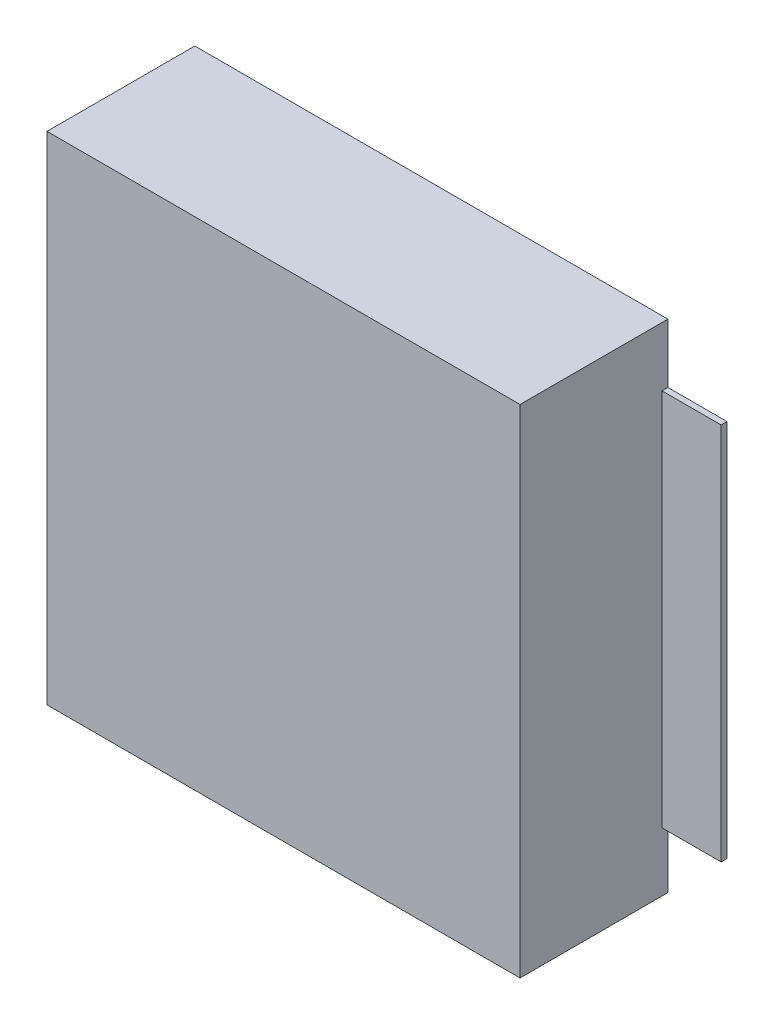
ISO-10303-21;
HEADER;
FILE_DESCRIPTION(('STEP AP214'),'2;1');
FILE_NAME('part.step','',(''),(''),'','','');
FILE_SCHEMA(('AUTOMOTIVE_DESIGN { 1 0 10303 214 1 1 1 1 }'));
ENDSEC;
DATA;
#1=APPLICATION_CONTEXT('core data for automotive mechanical design processes');
#2=APPLICATION_PROTOCOL_DEFINITION('international standard','automotive_design',2000,#1);
#3=PRODUCT_CONTEXT('',#1,'mechanical');
#4=PRODUCT('Part','Part','',(#3));
#5=PRODUCT_RELATED_PRODUCT_CATEGORY('part','',(#4));
#6=PRODUCT_DEFINITION_FORMATION('','',#4);
#7=PRODUCT_DEFINITION_CONTEXT('part definition',#1,'design');
#8=PRODUCT_DEFINITION('design','',#6,#7);
#9=PRODUCT_DEFINITION_SHAPE('','',#8);
#10=(LENGTH_UNIT() NAMED_UNIT(*) SI_UNIT(.MILLI.,.METRE.));
#11=(NAMED_UNIT(*) PLANE_ANGLE_UNIT() SI_UNIT($,.RADIAN.));
#12=(NAMED_UNIT(*) SI_UNIT($,.STERADIAN.) SOLID_ANGLE_UNIT());
#13=UNCERTAINTY_MEASURE_WITH_UNIT(LENGTH_MEASURE(1.E-05),#10,'distance_accuracy_value','');
#14=(GEOMETRIC_REPRESENTATION_CONTEXT(3) GLOBAL_UNCERTAINTY_ASSIGNED_CONTEXT((#13)) GLOBAL_UNIT_ASSIGNED_CONTEXT((#10,
#11,#12)) REPRESENTATION_CONTEXT('',''));
#15=CARTESIAN_POINT('',(0.,0.,0.));
#16=DIRECTION('',(0.,0.,1.));
#17=DIRECTION('',(1.,0.,0.));
#18=AXIS2_PLACEMENT_3D('',#15,#16,#17);
#19=CARTESIAN_POINT('',(-40.,-42.,25.));
#20=DIRECTION('',(1.,0.,0.));
#21=DIRECTION('',(0.,0.,-1.));
#22=AXIS2_PLACEMENT_3D('',#19,#20,#21);
#23=PLANE('',#22);
#24=DIRECTION('',(0.,0.,-1.));
#25=VECTOR('',#24,1.);
#26=CARTESIAN_POINT('',(-40.,42.,25.));
#27=LINE('',#26,#25);
#28=CARTESIAN_POINT('',(-40.,42.,25.));
#29=VERTEX_POINT('',#28);
#30=CARTESIAN_POINT('',(-40.,42.,0.));
#31=VERTEX_POINT('',#30);
#32=EDGE_CURVE('E144',#29,#31,#27,.T.);
#33=ORIENTED_EDGE('',*,*,#32,.T.);
#34=DIRECTION('',(0.,1.,0.));
#35=VECTOR('',#34,1.);
#36=CARTESIAN_POINT('',(-40.,42.,0.));
#37=LINE('',#36,#35);
#38=CARTESIAN_POINT('',(-40.,32.,0.));
#39=VERTEX_POINT('',#38);
#40=EDGE_CURVE('E161',#39,#31,#37,.T.);
#41=ORIENTED_EDGE('',*,*,#40,.F.);
#42=DIRECTION('',(0.,0.,1.));
#43=VECTOR('',#42,1.);
#44=CARTESIAN_POINT('',(-40.,32.,0.));
#45=LINE('',#44,#43);
#46=CARTESIAN_POINT('',(-40.,32.,1.));
#47=VERTEX_POINT('',#46);
#48=EDGE_CURVE('E215',#39,#47,#45,.T.);
#49=ORIENTED_EDGE('',*,*,#48,.T.);
#50=DIRECTION('',(0.,-1.,0.));
#51=VECTOR('',#50,1.);
#52=CARTESIAN_POINT('',(-40.,-42.,1.));
#53=LINE('',#52,#51);
#54=CARTESIAN_POINT('',(-40.,-32.,1.));
#55=VERTEX_POINT('',#54);
#56=EDGE_CURVE('E211',#47,#55,#53,.T.);
#57=ORIENTED_EDGE('',*,*,#56,.T.);
#58=DIRECTION('',(0.,0.,1.));
#59=VECTOR('',#58,1.);
#60=CARTESIAN_POINT('',(-40.,-32.,0.));
#61=LINE('',#60,#59);
#62=CARTESIAN_POINT('',(-40.,-32.,0.));
#63=VERTEX_POINT('',#62);
#64=EDGE_CURVE('E192',#63,#55,#61,.T.);
#65=ORIENTED_EDGE('',*,*,#64,.F.);
#66=DIRECTION('',(0.,1.,0.));
#67=VECTOR('',#66,1.);
#68=CARTESIAN_POINT('',(-40.,-42.,0.));
#69=LINE('',#68,#67);
#70=CARTESIAN_POINT('',(-40.,-42.,0.));
#71=VERTEX_POINT('',#70);
#72=EDGE_CURVE('E190',#71,#63,#69,.T.);
#73=ORIENTED_EDGE('',*,*,#72,.F.);
#74=DIRECTION('',(0.,0.,-1.));
#75=VECTOR('',#74,1.);
#76=CARTESIAN_POINT('',(-40.,-42.,25.));
#77=LINE('',#76,#75);
#78=CARTESIAN_POINT('',(-40.,-42.,25.));
#79=VERTEX_POINT('',#78);
#80=EDGE_CURVE('E11',#79,#71,#77,.T.);
#81=ORIENTED_EDGE('',*,*,#80,.F.);
#82=DIRECTION('',(0.,-1.,0.));
#83=VECTOR('',#82,1.);
#84=CARTESIAN_POINT('',(-40.,-42.,25.));
#85=LINE('',#84,#83);
#86=EDGE_CURVE('E162',#29,#79,#85,.T.);
#87=ORIENTED_EDGE('',*,*,#86,.F.);
#88=EDGE_LOOP('',(#33,#41,#49,#57,#65,#73,#81,#87));
#89=FACE_BOUND('',#88,.T.);
#90=ADVANCED_FACE('F45',(#89),#23,.F.);
#91=CARTESIAN_POINT('',(40.,-42.,25.));
#92=DIRECTION('',(0.,1.,0.));
#93=DIRECTION('',(-1.,0.,0.));
#94=AXIS2_PLACEMENT_3D('',#91,#92,#93);
#95=PLANE('',#94);
#96=DIRECTION('',(1.,0.,0.));
#97=VECTOR('',#96,1.);
#98=CARTESIAN_POINT('',(40.,-42.,0.));
#99=LINE('',#98,#97);
#100=CARTESIAN_POINT('',(40.,-42.,0.));
#101=VERTEX_POINT('',#100);
#102=EDGE_CURVE('E163',#71,#101,#99,.T.);
#103=ORIENTED_EDGE('',*,*,#102,.T.);
#104=DIRECTION('',(0.,0.,-1.));
#105=VECTOR('',#104,1.);
#106=CARTESIAN_POINT('',(40.,-42.,25.));
#107=LINE('',#106,#105);
#108=CARTESIAN_POINT('',(40.,-42.,25.));
#109=VERTEX_POINT('',#108);
#110=EDGE_CURVE('E52',#109,#101,#107,.T.);
#111=ORIENTED_EDGE('',*,*,#110,.F.);
#112=DIRECTION('',(1.,0.,0.));
#113=VECTOR('',#112,1.);
#114=CARTESIAN_POINT('',(40.,-42.,25.));
#115=LINE('',#114,#113);
#116=EDGE_CURVE('E166',#79,#109,#115,.T.);
#117=ORIENTED_EDGE('',*,*,#116,.F.);
#118=ORIENTED_EDGE('',*,*,#80,.T.);
#119=EDGE_LOOP('',(#103,#111,#117,#118));
#120=FACE_BOUND('',#119,.T.);
#121=ADVANCED_FACE('F185',(#120),#95,.F.);
#122=CARTESIAN_POINT('',(40.,-42.,25.));
#123=DIRECTION('',(-1.,0.,0.));
#124=DIRECTION('',(0.,0.,1.));
#125=AXIS2_PLACEMENT_3D('',#122,#123,#124);
#126=PLANE('',#125);
#127=ORIENTED_EDGE('',*,*,#110,.T.);
#128=DIRECTION('',(0.,-1.,0.));
#129=VECTOR('',#128,1.);
#130=CARTESIAN_POINT('',(40.,-42.,0.));
#131=LINE('',#130,#129);
#132=CARTESIAN_POINT('',(40.,-32.,0.));
#133=VERTEX_POINT('',#132);
#134=EDGE_CURVE('E176',#133,#101,#131,.T.);
#135=ORIENTED_EDGE('',*,*,#134,.F.);
#136=DIRECTION('',(0.,0.,1.));
#137=VECTOR('',#136,1.);
#138=CARTESIAN_POINT('',(40.,-32.,0.));
#139=LINE('',#138,#137);
#140=CARTESIAN_POINT('',(40.,-32.,1.));
#141=VERTEX_POINT('',#140);
#142=EDGE_CURVE('E245',#133,#141,#139,.T.);
#143=ORIENTED_EDGE('',*,*,#142,.T.);
#144=DIRECTION('',(0.,1.,0.));
#145=VECTOR('',#144,1.);
#146=CARTESIAN_POINT('',(40.,-42.,1.));
#147=LINE('',#146,#145);
#148=CARTESIAN_POINT('',(40.,32.,1.));
#149=VERTEX_POINT('',#148);
#150=EDGE_CURVE('E202',#141,#149,#147,.T.);
#151=ORIENTED_EDGE('',*,*,#150,.T.);
#152=DIRECTION('',(0.,0.,1.));
#153=VECTOR('',#152,1.);
#154=CARTESIAN_POINT('',(40.,32.,0.));
#155=LINE('',#154,#153);
#156=CARTESIAN_POINT('',(40.,32.,0.));
#157=VERTEX_POINT('',#156);
#158=EDGE_CURVE('E150',#157,#149,#155,.T.);
#159=ORIENTED_EDGE('',*,*,#158,.F.);
#160=DIRECTION('',(0.,-1.,0.));
#161=VECTOR('',#160,1.);
#162=CARTESIAN_POINT('',(40.,42.,0.));
#163=LINE('',#162,#161);
#164=CARTESIAN_POINT('',(40.,42.,0.));
#165=VERTEX_POINT('',#164);
#166=EDGE_CURVE('E147',#165,#157,#163,.T.);
#167=ORIENTED_EDGE('',*,*,#166,.F.);
#168=DIRECTION('',(0.,0.,-1.));
#169=VECTOR('',#168,1.);
#170=CARTESIAN_POINT('',(40.,42.,25.));
#171=LINE('',#170,#169);
#172=CARTESIAN_POINT('',(40.,42.,25.));
#173=VERTEX_POINT('',#172);
#174=EDGE_CURVE('E134',#173,#165,#171,.T.);
#175=ORIENTED_EDGE('',*,*,#174,.F.);
#176=DIRECTION('',(0.,1.,0.));
#177=VECTOR('',#176,1.);
#178=CARTESIAN_POINT('',(40.,-42.,25.));
#179=LINE('',#178,#177);
#180=EDGE_CURVE('E178',#109,#173,#179,.T.);
#181=ORIENTED_EDGE('',*,*,#180,.F.);
#182=EDGE_LOOP('',(#127,#135,#143,#151,#159,#167,#175,#181));
#183=FACE_BOUND('',#182,.T.);
#184=ADVANCED_FACE('F148',(#183),#126,.F.);
#185=CARTESIAN_POINT('',(40.,42.,25.));
#186=DIRECTION('',(0.,-1.,0.));
#187=DIRECTION('',(0.,0.,-1.));
#188=AXIS2_PLACEMENT_3D('',#185,#186,#187);
#189=PLANE('',#188);
#190=ORIENTED_EDGE('',*,*,#174,.T.);
#191=DIRECTION('',(-1.,0.,0.));
#192=VECTOR('',#191,1.);
#193=CARTESIAN_POINT('',(40.,42.,0.));
#194=LINE('',#193,#192);
#195=EDGE_CURVE('E139',#165,#31,#194,.T.);
#196=ORIENTED_EDGE('',*,*,#195,.T.);
#197=ORIENTED_EDGE('',*,*,#32,.F.);
#198=DIRECTION('',(-1.,0.,0.));
#199=VECTOR('',#198,1.);
#200=CARTESIAN_POINT('',(40.,42.,25.));
#201=LINE('',#200,#199);
#202=EDGE_CURVE('E141',#173,#29,#201,.T.);
#203=ORIENTED_EDGE('',*,*,#202,.F.);
#204=EDGE_LOOP('',(#190,#196,#197,#203));
#205=FACE_BOUND('',#204,.T.);
#206=ADVANCED_FACE('F136',(#205),#189,.F.);
#207=CARTESIAN_POINT('',(0.,0.,25.));
#208=DIRECTION('',(0.,0.,1.));
#209=DIRECTION('',(1.,0.,0.));
#210=AXIS2_PLACEMENT_3D('',#207,#208,#209);
#211=PLANE('',#210);
#212=ORIENTED_EDGE('',*,*,#86,.T.);
#213=ORIENTED_EDGE('',*,*,#116,.T.);
#214=ORIENTED_EDGE('',*,*,#180,.T.);
#215=ORIENTED_EDGE('',*,*,#202,.T.);
#216=EDGE_LOOP('',(#212,#213,#214,#215));
#217=FACE_BOUND('',#216,.T.);
#218=ADVANCED_FACE('F219',(#217),#211,.T.);
#219=CARTESIAN_POINT('',(0.,0.,0.));
#220=DIRECTION('',(0.,0.,1.));
#221=DIRECTION('',(1.,0.,0.));
#222=AXIS2_PLACEMENT_3D('',#219,#220,#221);
#223=PLANE('',#222);
#224=ORIENTED_EDGE('',*,*,#166,.T.);
#225=DIRECTION('',(1.,0.,0.));
#226=VECTOR('',#225,1.);
#227=CARTESIAN_POINT('',(50.,32.,0.));
#228=LINE('',#227,#226);
#229=CARTESIAN_POINT('',(50.,32.,0.));
#230=VERTEX_POINT('',#229);
#231=EDGE_CURVE('E154',#157,#230,#228,.T.);
#232=ORIENTED_EDGE('',*,*,#231,.T.);
#233=DIRECTION('',(0.,-1.,0.));
#234=VECTOR('',#233,1.);
#235=CARTESIAN_POINT('',(50.,42.,0.));
#236=LINE('',#235,#234);
#237=CARTESIAN_POINT('',(50.,-32.,0.));
#238=VERTEX_POINT('',#237);
#239=EDGE_CURVE('E204',#230,#238,#236,.T.);
#240=ORIENTED_EDGE('',*,*,#239,.T.);
#241=DIRECTION('',(-1.,0.,0.));
#242=VECTOR('',#241,1.);
#243=CARTESIAN_POINT('',(40.,-32.,0.));
#244=LINE('',#243,#242);
#245=EDGE_CURVE('E183',#238,#133,#244,.T.);
#246=ORIENTED_EDGE('',*,*,#245,.T.);
#247=ORIENTED_EDGE('',*,*,#134,.T.);
#248=ORIENTED_EDGE('',*,*,#102,.F.);
#249=ORIENTED_EDGE('',*,*,#72,.T.);
#250=DIRECTION('',(-1.,0.,0.));
#251=VECTOR('',#250,1.);
#252=CARTESIAN_POINT('',(-50.,-32.,0.));
#253=LINE('',#252,#251);
#254=CARTESIAN_POINT('',(-50.,-32.,0.));
#255=VERTEX_POINT('',#254);
#256=EDGE_CURVE('E196',#63,#255,#253,.T.);
#257=ORIENTED_EDGE('',*,*,#256,.T.);
#258=DIRECTION('',(0.,1.,0.));
#259=VECTOR('',#258,1.);
#260=CARTESIAN_POINT('',(-50.,42.,0.));
#261=LINE('',#260,#259);
#262=CARTESIAN_POINT('',(-50.,32.,0.));
#263=VERTEX_POINT('',#262);
#264=EDGE_CURVE('E208',#255,#263,#261,.T.);
#265=ORIENTED_EDGE('',*,*,#264,.T.);
#266=DIRECTION('',(1.,0.,0.));
#267=VECTOR('',#266,1.);
#268=CARTESIAN_POINT('',(-50.,32.,0.));
#269=LINE('',#268,#267);
#270=EDGE_CURVE('E220',#263,#39,#269,.T.);
#271=ORIENTED_EDGE('',*,*,#270,.T.);
#272=ORIENTED_EDGE('',*,*,#40,.T.);
#273=ORIENTED_EDGE('',*,*,#195,.F.);
#274=EDGE_LOOP('',(#224,#232,#240,#246,#247,#248,#249,#257,#265,#271,#272,#273));
#275=FACE_BOUND('',#274,.T.);
#276=ADVANCED_FACE('F158',(#275),#223,.F.);
#277=CARTESIAN_POINT('',(50.,42.,1.));
#278=DIRECTION('',(1.,0.,0.));
#279=DIRECTION('',(0.,1.,0.));
#280=AXIS2_PLACEMENT_3D('',#277,#278,#279);
#281=PLANE('',#280);
#282=DIRECTION('',(0.,0.,1.));
#283=VECTOR('',#282,1.);
#284=CARTESIAN_POINT('',(50.,32.,0.));
#285=LINE('',#284,#283);
#286=CARTESIAN_POINT('',(50.,32.,1.));
#287=VERTEX_POINT('',#286);
#288=EDGE_CURVE('E232',#230,#287,#285,.T.);
#289=ORIENTED_EDGE('',*,*,#288,.T.);
#290=DIRECTION('',(0.,-1.,0.));
#291=VECTOR('',#290,1.);
#292=CARTESIAN_POINT('',(50.,42.,1.));
#293=LINE('',#292,#291);
#294=CARTESIAN_POINT('',(50.,-32.,1.));
#295=VERTEX_POINT('',#294);
#296=EDGE_CURVE('E169',#287,#295,#293,.T.);
#297=ORIENTED_EDGE('',*,*,#296,.T.);
#298=DIRECTION('',(0.,0.,1.));
#299=VECTOR('',#298,1.);
#300=CARTESIAN_POINT('',(50.,-32.,0.));
#301=LINE('',#300,#299);
#302=EDGE_CURVE('E59',#238,#295,#301,.T.);
#303=ORIENTED_EDGE('',*,*,#302,.F.);
#304=ORIENTED_EDGE('',*,*,#239,.F.);
#305=EDGE_LOOP('',(#289,#297,#303,#304));
#306=FACE_BOUND('',#305,.T.);
#307=ADVANCED_FACE('F255',(#306),#281,.T.);
#308=CARTESIAN_POINT('',(0.,0.,1.));
#309=DIRECTION('',(0.,0.,-1.));
#310=DIRECTION('',(-1.,0.,0.));
#311=AXIS2_PLACEMENT_3D('',#308,#309,#310);
#312=PLANE('',#311);
#313=ORIENTED_EDGE('',*,*,#296,.F.);
#314=DIRECTION('',(1.,0.,0.));
#315=VECTOR('',#314,1.);
#316=CARTESIAN_POINT('',(50.,32.,1.));
#317=LINE('',#316,#315);
#318=EDGE_CURVE('E155',#149,#287,#317,.T.);
#319=ORIENTED_EDGE('',*,*,#318,.F.);
#320=ORIENTED_EDGE('',*,*,#150,.F.);
#321=DIRECTION('',(-1.,0.,0.));
#322=VECTOR('',#321,1.);
#323=CARTESIAN_POINT('',(40.,-32.,1.));
#324=LINE('',#323,#322);
#325=EDGE_CURVE('E247',#295,#141,#324,.T.);
#326=ORIENTED_EDGE('',*,*,#325,.F.);
#327=EDGE_LOOP('',(#313,#319,#320,#326));
#328=FACE_BOUND('',#327,.T.);
#329=ADVANCED_FACE('F253',(#328),#312,.F.);
#330=CARTESIAN_POINT('',(-50.,42.,1.));
#331=DIRECTION('',(-1.,0.,0.));
#332=DIRECTION('',(0.,-1.,0.));
#333=AXIS2_PLACEMENT_3D('',#330,#331,#332);
#334=PLANE('',#333);
#335=DIRECTION('',(0.,0.,1.));
#336=VECTOR('',#335,1.);
#337=CARTESIAN_POINT('',(-50.,32.,0.));
#338=LINE('',#337,#336);
#339=CARTESIAN_POINT('',(-50.,32.,1.));
#340=VERTEX_POINT('',#339);
#341=EDGE_CURVE('E67',#263,#340,#338,.T.);
#342=ORIENTED_EDGE('',*,*,#341,.F.);
#343=ORIENTED_EDGE('',*,*,#264,.F.);
#344=DIRECTION('',(0.,0.,1.));
#345=VECTOR('',#344,1.);
#346=CARTESIAN_POINT('',(-50.,-32.,0.));
#347=LINE('',#346,#345);
#348=CARTESIAN_POINT('',(-50.,-32.,1.));
#349=VERTEX_POINT('',#348);
#350=EDGE_CURVE('E230',#255,#349,#347,.T.);
#351=ORIENTED_EDGE('',*,*,#350,.T.);
#352=DIRECTION('',(0.,1.,0.));
#353=VECTOR('',#352,1.);
#354=CARTESIAN_POINT('',(-50.,42.,1.));
#355=LINE('',#354,#353);
#356=EDGE_CURVE('E212',#349,#340,#355,.T.);
#357=ORIENTED_EDGE('',*,*,#356,.T.);
#358=EDGE_LOOP('',(#342,#343,#351,#357));
#359=FACE_BOUND('',#358,.T.);
#360=ADVANCED_FACE('F263',(#359),#334,.T.);
#361=CARTESIAN_POINT('',(0.,0.,1.));
#362=DIRECTION('',(0.,0.,1.));
#363=DIRECTION('',(1.,0.,0.));
#364=AXIS2_PLACEMENT_3D('',#361,#362,#363);
#365=PLANE('',#364);
#366=DIRECTION('',(1.,0.,0.));
#367=VECTOR('',#366,1.);
#368=CARTESIAN_POINT('',(-50.,32.,1.));
#369=LINE('',#368,#367);
#370=EDGE_CURVE('E198',#340,#47,#369,.T.);
#371=ORIENTED_EDGE('',*,*,#370,.F.);
#372=ORIENTED_EDGE('',*,*,#356,.F.);
#373=DIRECTION('',(-1.,0.,0.));
#374=VECTOR('',#373,1.);
#375=CARTESIAN_POINT('',(-50.,-32.,1.));
#376=LINE('',#375,#374);
#377=EDGE_CURVE('E195',#55,#349,#376,.T.);
#378=ORIENTED_EDGE('',*,*,#377,.F.);
#379=ORIENTED_EDGE('',*,*,#56,.F.);
#380=EDGE_LOOP('',(#371,#372,#378,#379));
#381=FACE_BOUND('',#380,.T.);
#382=ADVANCED_FACE('F280',(#381),#365,.T.);
#383=CARTESIAN_POINT('',(-50.,-32.,0.));
#384=DIRECTION('',(0.,1.,0.));
#385=DIRECTION('',(0.,0.,1.));
#386=AXIS2_PLACEMENT_3D('',#383,#384,#385);
#387=PLANE('',#386);
#388=ORIENTED_EDGE('',*,*,#377,.T.);
#389=ORIENTED_EDGE('',*,*,#350,.F.);
#390=ORIENTED_EDGE('',*,*,#256,.F.);
#391=ORIENTED_EDGE('',*,*,#64,.T.);
#392=EDGE_LOOP('',(#388,#389,#390,#391));
#393=FACE_BOUND('',#392,.T.);
#394=ADVANCED_FACE('F282',(#393),#387,.F.);
#395=CARTESIAN_POINT('',(-50.,32.,0.));
#396=DIRECTION('',(0.,-1.,0.));
#397=DIRECTION('',(0.,0.,-1.));
#398=AXIS2_PLACEMENT_3D('',#395,#396,#397);
#399=PLANE('',#398);
#400=ORIENTED_EDGE('',*,*,#370,.T.);
#401=ORIENTED_EDGE('',*,*,#48,.F.);
#402=ORIENTED_EDGE('',*,*,#270,.F.);
#403=ORIENTED_EDGE('',*,*,#341,.T.);
#404=EDGE_LOOP('',(#400,#401,#402,#403));
#405=FACE_BOUND('',#404,.T.);
#406=ADVANCED_FACE('F291',(#405),#399,.F.);
#407=CARTESIAN_POINT('',(40.,-32.,0.));
#408=DIRECTION('',(0.,1.,0.));
#409=DIRECTION('',(0.,0.,1.));
#410=AXIS2_PLACEMENT_3D('',#407,#408,#409);
#411=PLANE('',#410);
#412=ORIENTED_EDGE('',*,*,#325,.T.);
#413=ORIENTED_EDGE('',*,*,#142,.F.);
#414=ORIENTED_EDGE('',*,*,#245,.F.);
#415=ORIENTED_EDGE('',*,*,#302,.T.);
#416=EDGE_LOOP('',(#412,#413,#414,#415));
#417=FACE_BOUND('',#416,.T.);
#418=ADVANCED_FACE('F254',(#417),#411,.F.);
#419=CARTESIAN_POINT('',(50.,32.,0.));
#420=DIRECTION('',(0.,-1.,0.));
#421=DIRECTION('',(0.,0.,-1.));
#422=AXIS2_PLACEMENT_3D('',#419,#420,#421);
#423=PLANE('',#422);
#424=ORIENTED_EDGE('',*,*,#318,.T.);
#425=ORIENTED_EDGE('',*,*,#288,.F.);
#426=ORIENTED_EDGE('',*,*,#231,.F.);
#427=ORIENTED_EDGE('',*,*,#158,.T.);
#428=EDGE_LOOP('',(#424,#425,#426,#427));
#429=FACE_BOUND('',#428,.T.);
#430=ADVANCED_FACE('F251',(#429),#423,.F.);
#431=CLOSED_SHELL('',(#90,#121,#184,#206,#218,#276,#307,#329,#360,#382,#394,#406,#418,#430));
#432=MANIFOLD_SOLID_BREP('B2',#431);
#433=ADVANCED_BREP_SHAPE_REPRESENTATION('',(#18,#432),#14);
#434=SHAPE_DEFINITION_REPRESENTATION(#9,#433);
ENDSEC;
END-ISO-10303-21;
